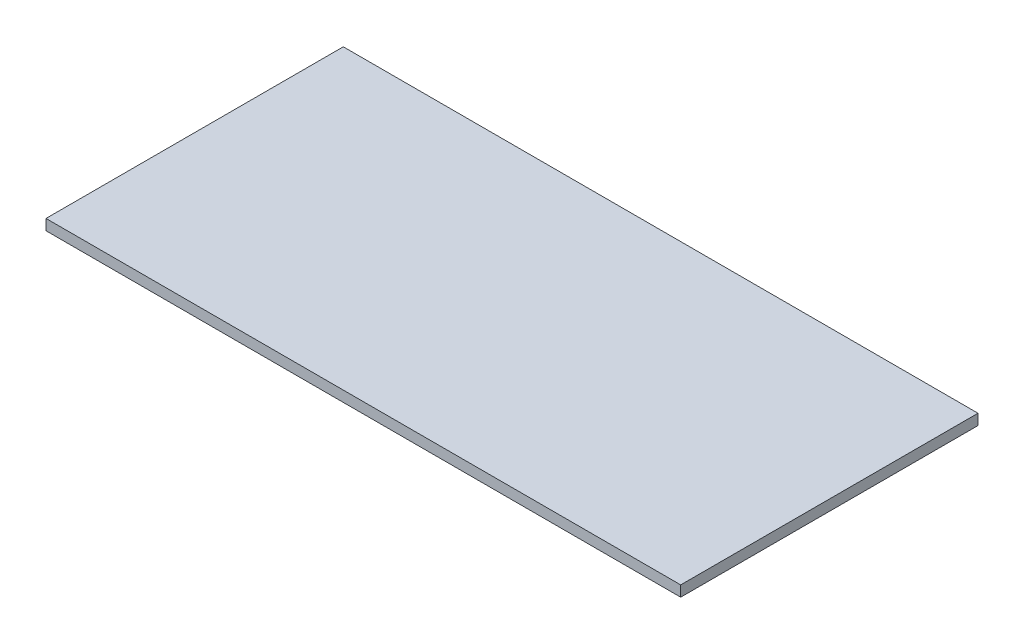
ISO-10303-21;
HEADER;
FILE_DESCRIPTION(('STEP AP214'),'2;1');
FILE_NAME('part.step','',(''),(''),'','','');
FILE_SCHEMA(('AUTOMOTIVE_DESIGN { 1 0 10303 214 1 1 1 1 }'));
ENDSEC;
DATA;
#1=APPLICATION_CONTEXT('core data for automotive mechanical design processes');
#2=APPLICATION_PROTOCOL_DEFINITION('international standard','automotive_design',2000,#1);
#3=PRODUCT_CONTEXT('',#1,'mechanical');
#4=PRODUCT('Part','Part','',(#3));
#5=PRODUCT_RELATED_PRODUCT_CATEGORY('part','',(#4));
#6=PRODUCT_DEFINITION_FORMATION('','',#4);
#7=PRODUCT_DEFINITION_CONTEXT('part definition',#1,'design');
#8=PRODUCT_DEFINITION('design','',#6,#7);
#9=PRODUCT_DEFINITION_SHAPE('','',#8);
#10=(LENGTH_UNIT() NAMED_UNIT(*) SI_UNIT(.MILLI.,.METRE.));
#11=(NAMED_UNIT(*) PLANE_ANGLE_UNIT() SI_UNIT($,.RADIAN.));
#12=(NAMED_UNIT(*) SI_UNIT($,.STERADIAN.) SOLID_ANGLE_UNIT());
#13=UNCERTAINTY_MEASURE_WITH_UNIT(LENGTH_MEASURE(1.E-05),#10,'distance_accuracy_value','');
#14=(GEOMETRIC_REPRESENTATION_CONTEXT(3) GLOBAL_UNCERTAINTY_ASSIGNED_CONTEXT((#13)) GLOBAL_UNIT_ASSIGNED_CONTEXT((#10,
#11,#12)) REPRESENTATION_CONTEXT('',''));
#15=CARTESIAN_POINT('',(0.,0.,0.));
#16=DIRECTION('',(0.,0.,1.));
#17=DIRECTION('',(1.,0.,0.));
#18=AXIS2_PLACEMENT_3D('',#15,#16,#17);
#19=CARTESIAN_POINT('',(-95.,3.2,-44.5));
#20=DIRECTION('',(1.,0.,0.));
#21=DIRECTION('',(0.,0.,-1.));
#22=AXIS2_PLACEMENT_3D('',#19,#20,#21);
#23=PLANE('',#22);
#24=DIRECTION('',(0.,0.,1.));
#25=VECTOR('',#24,1.);
#26=CARTESIAN_POINT('',(-95.,0.,-44.5));
#27=LINE('',#26,#25);
#28=CARTESIAN_POINT('',(-95.,0.,-44.5));
#29=VERTEX_POINT('',#28);
#30=CARTESIAN_POINT('',(-95.,0.,44.5));
#31=VERTEX_POINT('',#30);
#32=EDGE_CURVE('E96',#29,#31,#27,.T.);
#33=ORIENTED_EDGE('',*,*,#32,.T.);
#34=DIRECTION('',(0.,-1.,0.));
#35=VECTOR('',#34,1.);
#36=CARTESIAN_POINT('',(-95.,3.2,44.5));
#37=LINE('',#36,#35);
#38=CARTESIAN_POINT('',(-95.,3.2,44.5));
#39=VERTEX_POINT('',#38);
#40=EDGE_CURVE('E11',#39,#31,#37,.T.);
#41=ORIENTED_EDGE('',*,*,#40,.F.);
#42=DIRECTION('',(0.,0.,1.));
#43=VECTOR('',#42,1.);
#44=CARTESIAN_POINT('',(-95.,3.2,-44.5));
#45=LINE('',#44,#43);
#46=CARTESIAN_POINT('',(-95.,3.2,-44.5));
#47=VERTEX_POINT('',#46);
#48=EDGE_CURVE('E84',#47,#39,#45,.T.);
#49=ORIENTED_EDGE('',*,*,#48,.F.);
#50=DIRECTION('',(0.,-1.,0.));
#51=VECTOR('',#50,1.);
#52=CARTESIAN_POINT('',(-95.,3.2,-44.5));
#53=LINE('',#52,#51);
#54=EDGE_CURVE('E92',#47,#29,#53,.T.);
#55=ORIENTED_EDGE('',*,*,#54,.T.);
#56=EDGE_LOOP('',(#33,#41,#49,#55));
#57=FACE_BOUND('',#56,.T.);
#58=ADVANCED_FACE('F33',(#57),#23,.F.);
#59=CARTESIAN_POINT('',(95.,3.2,44.5));
#60=DIRECTION('',(0.,0.,-1.));
#61=DIRECTION('',(-1.,0.,0.));
#62=AXIS2_PLACEMENT_3D('',#59,#60,#61);
#63=PLANE('',#62);
#64=DIRECTION('',(1.,0.,0.));
#65=VECTOR('',#64,1.);
#66=CARTESIAN_POINT('',(95.,0.,44.5));
#67=LINE('',#66,#65);
#68=CARTESIAN_POINT('',(95.,0.,44.5));
#69=VERTEX_POINT('',#68);
#70=EDGE_CURVE('E88',#31,#69,#67,.T.);
#71=ORIENTED_EDGE('',*,*,#70,.T.);
#72=DIRECTION('',(0.,-1.,0.));
#73=VECTOR('',#72,1.);
#74=CARTESIAN_POINT('',(95.,3.2,44.5));
#75=LINE('',#74,#73);
#76=CARTESIAN_POINT('',(95.,3.2,44.5));
#77=VERTEX_POINT('',#76);
#78=EDGE_CURVE('E41',#77,#69,#75,.T.);
#79=ORIENTED_EDGE('',*,*,#78,.F.);
#80=DIRECTION('',(1.,0.,0.));
#81=VECTOR('',#80,1.);
#82=CARTESIAN_POINT('',(95.,3.2,44.5));
#83=LINE('',#82,#81);
#84=EDGE_CURVE('E79',#39,#77,#83,.T.);
#85=ORIENTED_EDGE('',*,*,#84,.F.);
#86=ORIENTED_EDGE('',*,*,#40,.T.);
#87=EDGE_LOOP('',(#71,#79,#85,#86));
#88=FACE_BOUND('',#87,.T.);
#89=ADVANCED_FACE('F87',(#88),#63,.F.);
#90=CARTESIAN_POINT('',(95.,3.2,-44.5));
#91=DIRECTION('',(-1.,0.,0.));
#92=DIRECTION('',(0.,0.,1.));
#93=AXIS2_PLACEMENT_3D('',#90,#91,#92);
#94=PLANE('',#93);
#95=DIRECTION('',(0.,0.,-1.));
#96=VECTOR('',#95,1.);
#97=CARTESIAN_POINT('',(95.,0.,-44.5));
#98=LINE('',#97,#96);
#99=CARTESIAN_POINT('',(95.,0.,-44.5));
#100=VERTEX_POINT('',#99);
#101=EDGE_CURVE('E66',#69,#100,#98,.T.);
#102=ORIENTED_EDGE('',*,*,#101,.T.);
#103=DIRECTION('',(0.,-1.,0.));
#104=VECTOR('',#103,1.);
#105=CARTESIAN_POINT('',(95.,3.2,-44.5));
#106=LINE('',#105,#104);
#107=CARTESIAN_POINT('',(95.,3.2,-44.5));
#108=VERTEX_POINT('',#107);
#109=EDGE_CURVE('E89',#108,#100,#106,.T.);
#110=ORIENTED_EDGE('',*,*,#109,.F.);
#111=DIRECTION('',(0.,0.,-1.));
#112=VECTOR('',#111,1.);
#113=CARTESIAN_POINT('',(95.,3.2,-44.5));
#114=LINE('',#113,#112);
#115=EDGE_CURVE('E82',#77,#108,#114,.T.);
#116=ORIENTED_EDGE('',*,*,#115,.F.);
#117=ORIENTED_EDGE('',*,*,#78,.T.);
#118=EDGE_LOOP('',(#102,#110,#116,#117));
#119=FACE_BOUND('',#118,.T.);
#120=ADVANCED_FACE('F90',(#119),#94,.F.);
#121=CARTESIAN_POINT('',(95.,3.2,-44.5));
#122=DIRECTION('',(0.,0.,1.));
#123=DIRECTION('',(1.,0.,0.));
#124=AXIS2_PLACEMENT_3D('',#121,#122,#123);
#125=PLANE('',#124);
#126=DIRECTION('',(-1.,0.,0.));
#127=VECTOR('',#126,1.);
#128=CARTESIAN_POINT('',(95.,0.,-44.5));
#129=LINE('',#128,#127);
#130=EDGE_CURVE('E72',#100,#29,#129,.T.);
#131=ORIENTED_EDGE('',*,*,#130,.T.);
#132=ORIENTED_EDGE('',*,*,#54,.F.);
#133=DIRECTION('',(-1.,0.,0.));
#134=VECTOR('',#133,1.);
#135=CARTESIAN_POINT('',(95.,3.2,-44.5));
#136=LINE('',#135,#134);
#137=EDGE_CURVE('E49',#108,#47,#136,.T.);
#138=ORIENTED_EDGE('',*,*,#137,.F.);
#139=ORIENTED_EDGE('',*,*,#109,.T.);
#140=EDGE_LOOP('',(#131,#132,#138,#139));
#141=FACE_BOUND('',#140,.T.);
#142=ADVANCED_FACE('F103',(#141),#125,.F.);
#143=CARTESIAN_POINT('',(0.,3.2,0.));
#144=DIRECTION('',(0.,-1.,0.));
#145=DIRECTION('',(0.,0.,-1.));
#146=AXIS2_PLACEMENT_3D('',#143,#144,#145);
#147=PLANE('',#146);
#148=ORIENTED_EDGE('',*,*,#48,.T.);
#149=ORIENTED_EDGE('',*,*,#84,.T.);
#150=ORIENTED_EDGE('',*,*,#115,.T.);
#151=ORIENTED_EDGE('',*,*,#137,.T.);
#152=EDGE_LOOP('',(#148,#149,#150,#151));
#153=FACE_BOUND('',#152,.T.);
#154=ADVANCED_FACE('F80',(#153),#147,.F.);
#155=CARTESIAN_POINT('',(0.,0.,0.));
#156=DIRECTION('',(0.,-1.,0.));
#157=DIRECTION('',(0.,0.,-1.));
#158=AXIS2_PLACEMENT_3D('',#155,#156,#157);
#159=PLANE('',#158);
#160=ORIENTED_EDGE('',*,*,#32,.F.);
#161=ORIENTED_EDGE('',*,*,#130,.F.);
#162=ORIENTED_EDGE('',*,*,#101,.F.);
#163=ORIENTED_EDGE('',*,*,#70,.F.);
#164=EDGE_LOOP('',(#160,#161,#162,#163));
#165=FACE_BOUND('',#164,.T.);
#166=ADVANCED_FACE('F106',(#165),#159,.T.);
#167=CLOSED_SHELL('',(#58,#89,#120,#142,#154,#166));
#168=MANIFOLD_SOLID_BREP('B2',#167);
#169=ADVANCED_BREP_SHAPE_REPRESENTATION('',(#18,#168),#14);
#170=SHAPE_DEFINITION_REPRESENTATION(#9,#169);
ENDSEC;
END-ISO-10303-21;
